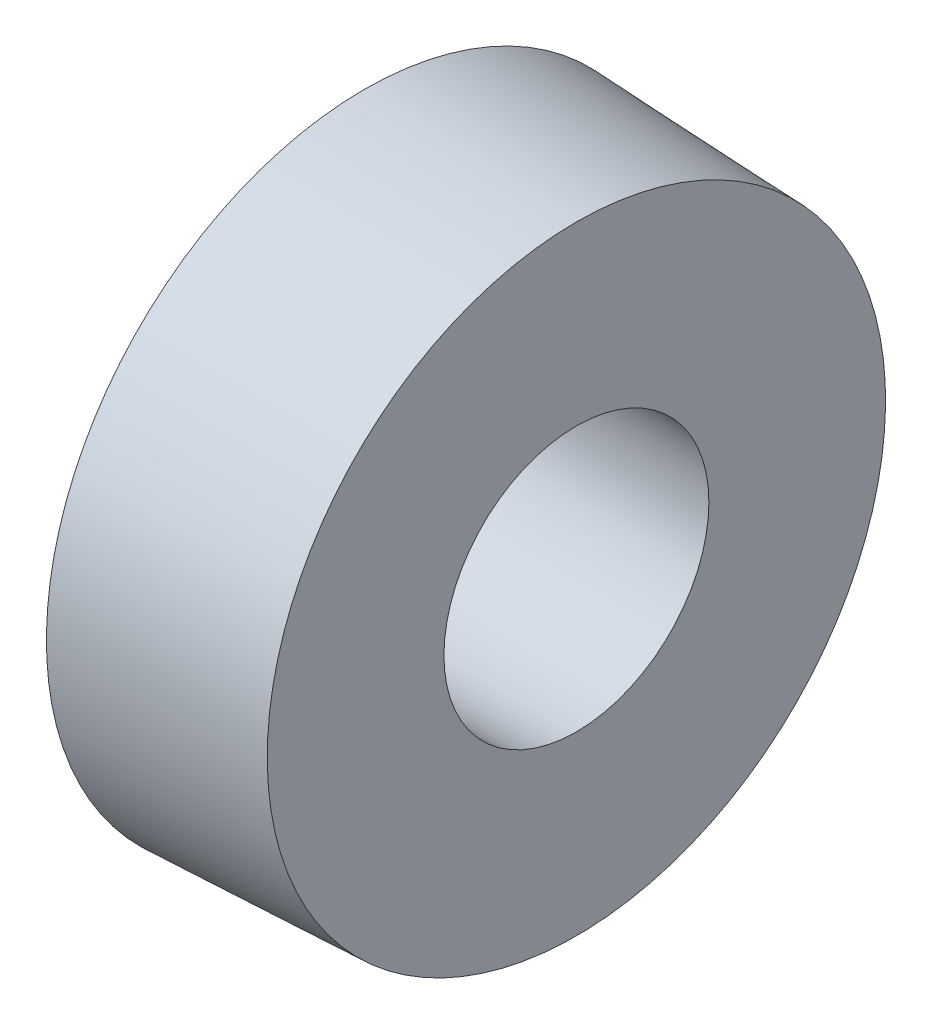
ISO-10303-21;
HEADER;
FILE_DESCRIPTION(('STEP AP214'),'2;1');
FILE_NAME('part.step','',(''),(''),'','','');
FILE_SCHEMA(('AUTOMOTIVE_DESIGN { 1 0 10303 214 1 1 1 1 }'));
ENDSEC;
DATA;
#1=APPLICATION_CONTEXT('core data for automotive mechanical design processes');
#2=APPLICATION_PROTOCOL_DEFINITION('international standard','automotive_design',2000,#1);
#3=PRODUCT_CONTEXT('',#1,'mechanical');
#4=PRODUCT('Part','Part','',(#3));
#5=PRODUCT_RELATED_PRODUCT_CATEGORY('part','',(#4));
#6=PRODUCT_DEFINITION_FORMATION('','',#4);
#7=PRODUCT_DEFINITION_CONTEXT('part definition',#1,'design');
#8=PRODUCT_DEFINITION('design','',#6,#7);
#9=PRODUCT_DEFINITION_SHAPE('','',#8);
#10=(LENGTH_UNIT() NAMED_UNIT(*) SI_UNIT(.MILLI.,.METRE.));
#11=(NAMED_UNIT(*) PLANE_ANGLE_UNIT() SI_UNIT($,.RADIAN.));
#12=(NAMED_UNIT(*) SI_UNIT($,.STERADIAN.) SOLID_ANGLE_UNIT());
#13=UNCERTAINTY_MEASURE_WITH_UNIT(LENGTH_MEASURE(1.E-05),#10,'distance_accuracy_value','');
#14=(GEOMETRIC_REPRESENTATION_CONTEXT(3) GLOBAL_UNCERTAINTY_ASSIGNED_CONTEXT((#13)) GLOBAL_UNIT_ASSIGNED_CONTEXT((#10,
#11,#12)) REPRESENTATION_CONTEXT('',''));
#15=CARTESIAN_POINT('',(0.,0.,0.));
#16=DIRECTION('',(0.,0.,1.));
#17=DIRECTION('',(1.,0.,0.));
#18=AXIS2_PLACEMENT_3D('',#15,#16,#17);
#19=CARTESIAN_POINT('',(0.,0.,0.));
#20=DIRECTION('',(-1.,0.,0.));
#21=DIRECTION('',(0.,0.,1.));
#22=AXIS2_PLACEMENT_3D('',#19,#20,#21);
#23=CYLINDRICAL_SURFACE('',#22,300.);
#24=CARTESIAN_POINT('',(6120.,0.,0.));
#25=DIRECTION('',(-1.,0.,0.));
#26=DIRECTION('',(0.,0.,1.));
#27=AXIS2_PLACEMENT_3D('',#24,#25,#26);
#28=CIRCLE('',#27,300.);
#29=CARTESIAN_POINT('',(6120.,300.,-2.15387581790497E-06));
#30=VERTEX_POINT('',#29);
#31=CARTESIAN_POINT('',(6120.,300.,0.));
#32=VERTEX_POINT('',#31);
#33=EDGE_CURVE('E11',#30,#32,#28,.T.);
#34=ORIENTED_EDGE('',*,*,#33,.T.);
#35=DIRECTION('',(1.,0.,0.));
#36=VECTOR('',#35,1.);
#37=CARTESIAN_POINT('',(6600.,300.,0.));
#38=LINE('',#37,#36);
#39=CARTESIAN_POINT('',(6600.,300.,0.));
#40=VERTEX_POINT('',#39);
#41=EDGE_CURVE('E100',#32,#40,#38,.T.);
#42=ORIENTED_EDGE('',*,*,#41,.T.);
#43=CARTESIAN_POINT('',(6600.,0.,0.));
#44=DIRECTION('',(-1.,0.,0.));
#45=DIRECTION('',(0.,0.,1.));
#46=AXIS2_PLACEMENT_3D('',#43,#44,#45);
#47=CIRCLE('',#46,300.);
#48=CARTESIAN_POINT('',(6600.,300.,-2.15387581790497E-06));
#49=VERTEX_POINT('',#48);
#50=EDGE_CURVE('E80',#49,#40,#47,.T.);
#51=ORIENTED_EDGE('',*,*,#50,.F.);
#52=DIRECTION('',(1.,0.,0.));
#53=VECTOR('',#52,1.);
#54=CARTESIAN_POINT('',(6600.,300.,-2.15387581790497E-06));
#55=LINE('',#54,#53);
#56=EDGE_CURVE('E103',#30,#49,#55,.T.);
#57=ORIENTED_EDGE('',*,*,#56,.F.);
#58=EDGE_LOOP('',(#34,#42,#51,#57));
#59=FACE_BOUND('',#58,.T.);
#60=ADVANCED_FACE('F39',(#59),#23,.F.);
#61=CARTESIAN_POINT('',(6120.,300.,-2.15387581790497E-06));
#62=DIRECTION('',(1.,0.,0.));
#63=DIRECTION('',(0.,0.,-1.));
#64=AXIS2_PLACEMENT_3D('',#61,#62,#63);
#65=PLANE('',#64);
#66=CARTESIAN_POINT('',(6120.,0.,0.));
#67=DIRECTION('',(-1.,0.,0.));
#68=DIRECTION('',(0.,0.,1.));
#69=AXIS2_PLACEMENT_3D('',#66,#67,#68);
#70=CIRCLE('',#69,720.);
#71=CARTESIAN_POINT('',(6120.,720.,-5.16930196297192E-06));
#72=VERTEX_POINT('',#71);
#73=CARTESIAN_POINT('',(6120.,720.,0.));
#74=VERTEX_POINT('',#73);
#75=EDGE_CURVE('E50',#72,#74,#70,.T.);
#76=ORIENTED_EDGE('',*,*,#75,.T.);
#77=DIRECTION('',(0.,-1.,0.));
#78=VECTOR('',#77,1.);
#79=CARTESIAN_POINT('',(6120.,300.,0.));
#80=LINE('',#79,#78);
#81=EDGE_CURVE('E104',#74,#32,#80,.T.);
#82=ORIENTED_EDGE('',*,*,#81,.T.);
#83=ORIENTED_EDGE('',*,*,#33,.F.);
#84=DIRECTION('',(0.,-1.,7.17958605968322E-09));
#85=VECTOR('',#84,1.);
#86=CARTESIAN_POINT('',(6120.,300.,-2.15387581790497E-06));
#87=LINE('',#86,#85);
#88=EDGE_CURVE('E91',#72,#30,#87,.T.);
#89=ORIENTED_EDGE('',*,*,#88,.F.);
#90=EDGE_LOOP('',(#76,#82,#83,#89));
#91=FACE_BOUND('',#90,.T.);
#92=ADVANCED_FACE('F41',(#91),#65,.F.);
#93=CARTESIAN_POINT('',(6600.,0.,0.));
#94=DIRECTION('',(-1.,0.,0.));
#95=DIRECTION('',(0.,0.,1.));
#96=AXIS2_PLACEMENT_3D('',#93,#94,#95);
#97=CONICAL_SURFACE('',#96,700.,0.0416425790985885);
#98=CARTESIAN_POINT('',(6600.,0.,0.));
#99=DIRECTION('',(-1.,0.,0.));
#100=DIRECTION('',(0.,0.,1.));
#101=AXIS2_PLACEMENT_3D('',#98,#99,#100);
#102=CIRCLE('',#101,700.);
#103=CARTESIAN_POINT('',(6600.,700.,-5.02571024177826E-06));
#104=VERTEX_POINT('',#103);
#105=CARTESIAN_POINT('',(6600.,700.,0.));
#106=VERTEX_POINT('',#105);
#107=EDGE_CURVE('E89',#104,#106,#102,.T.);
#108=ORIENTED_EDGE('',*,*,#107,.T.);
#109=DIRECTION('',(-0.999133073092352,0.0416305447121814,0.));
#110=VECTOR('',#109,1.);
#111=CARTESIAN_POINT('',(6120.,720.,0.));
#112=LINE('',#111,#110);
#113=EDGE_CURVE('E97',#106,#74,#112,.T.);
#114=ORIENTED_EDGE('',*,*,#113,.T.);
#115=ORIENTED_EDGE('',*,*,#75,.F.);
#116=DIRECTION('',(-0.999133073092352,0.0416305447121814,-2.98890078472597E-10));
#117=VECTOR('',#116,1.);
#118=CARTESIAN_POINT('',(6120.,720.,-5.16930196297192E-06));
#119=LINE('',#118,#117);
#120=EDGE_CURVE('E109',#104,#72,#119,.T.);
#121=ORIENTED_EDGE('',*,*,#120,.F.);
#122=EDGE_LOOP('',(#108,#114,#115,#121));
#123=FACE_BOUND('',#122,.T.);
#124=ADVANCED_FACE('F112',(#123),#97,.T.);
#125=CARTESIAN_POINT('',(6600.,700.,-5.02571024177826E-06));
#126=DIRECTION('',(-1.,0.,0.));
#127=DIRECTION('',(0.,0.,1.));
#128=AXIS2_PLACEMENT_3D('',#125,#126,#127);
#129=PLANE('',#128);
#130=DIRECTION('',(0.,1.,-7.17958605968322E-09));
#131=VECTOR('',#130,1.);
#132=CARTESIAN_POINT('',(6600.,700.,-5.02571024177826E-06));
#133=LINE('',#132,#131);
#134=EDGE_CURVE('E82',#49,#104,#133,.T.);
#135=ORIENTED_EDGE('',*,*,#134,.F.);
#136=ORIENTED_EDGE('',*,*,#50,.T.);
#137=DIRECTION('',(0.,1.,0.));
#138=VECTOR('',#137,1.);
#139=CARTESIAN_POINT('',(6600.,700.,0.));
#140=LINE('',#139,#138);
#141=EDGE_CURVE('E85',#40,#106,#140,.T.);
#142=ORIENTED_EDGE('',*,*,#141,.T.);
#143=ORIENTED_EDGE('',*,*,#107,.F.);
#144=EDGE_LOOP('',(#135,#136,#142,#143));
#145=FACE_BOUND('',#144,.T.);
#146=ADVANCED_FACE('F83',(#145),#129,.F.);
#147=CARTESIAN_POINT('',(0.,0.,0.));
#148=DIRECTION('',(0.,-7.17958605968322E-09,-1.));
#149=DIRECTION('',(-1.,0.,0.));
#150=AXIS2_PLACEMENT_3D('',#147,#148,#149);
#151=PLANE('',#150);
#152=ORIENTED_EDGE('',*,*,#56,.T.);
#153=ORIENTED_EDGE('',*,*,#134,.T.);
#154=ORIENTED_EDGE('',*,*,#120,.T.);
#155=ORIENTED_EDGE('',*,*,#88,.T.);
#156=EDGE_LOOP('',(#152,#153,#154,#155));
#157=FACE_BOUND('',#156,.T.);
#158=ADVANCED_FACE('F111',(#157),#151,.F.);
#159=CARTESIAN_POINT('',(0.,0.,0.));
#160=DIRECTION('',(0.,0.,-1.));
#161=DIRECTION('',(-1.,0.,0.));
#162=AXIS2_PLACEMENT_3D('',#159,#160,#161);
#163=PLANE('',#162);
#164=ORIENTED_EDGE('',*,*,#41,.F.);
#165=ORIENTED_EDGE('',*,*,#81,.F.);
#166=ORIENTED_EDGE('',*,*,#113,.F.);
#167=ORIENTED_EDGE('',*,*,#141,.F.);
#168=EDGE_LOOP('',(#164,#165,#166,#167));
#169=FACE_BOUND('',#168,.T.);
#170=ADVANCED_FACE('F94',(#169),#163,.T.);
#171=CLOSED_SHELL('',(#60,#92,#124,#146,#158,#170));
#172=MANIFOLD_SOLID_BREP('B2',#171);
#173=ADVANCED_BREP_SHAPE_REPRESENTATION('',(#18,#172),#14);
#174=SHAPE_DEFINITION_REPRESENTATION(#9,#173);
ENDSEC;
END-ISO-10303-21;
